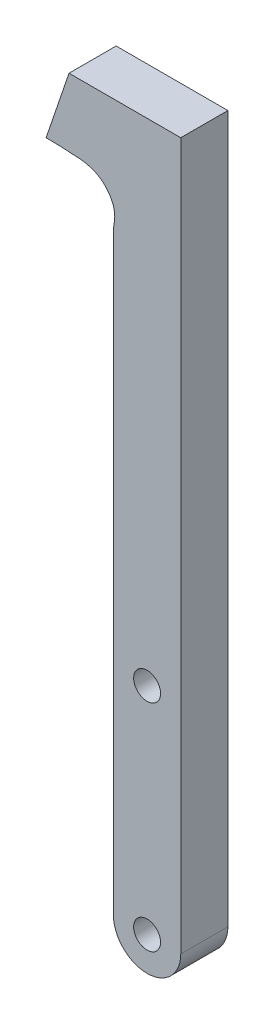
ISO-10303-21;
HEADER;
FILE_DESCRIPTION(('STEP AP214'),'2;1');
FILE_NAME('part.step','',(''),(''),'','','');
FILE_SCHEMA(('AUTOMOTIVE_DESIGN { 1 0 10303 214 1 1 1 1 }'));
ENDSEC;
DATA;
#1=APPLICATION_CONTEXT('core data for automotive mechanical design processes');
#2=APPLICATION_PROTOCOL_DEFINITION('international standard','automotive_design',2000,#1);
#3=PRODUCT_CONTEXT('',#1,'mechanical');
#4=PRODUCT('Part','Part','',(#3));
#5=PRODUCT_RELATED_PRODUCT_CATEGORY('part','',(#4));
#6=PRODUCT_DEFINITION_FORMATION('','',#4);
#7=PRODUCT_DEFINITION_CONTEXT('part definition',#1,'design');
#8=PRODUCT_DEFINITION('design','',#6,#7);
#9=PRODUCT_DEFINITION_SHAPE('','',#8);
#10=(LENGTH_UNIT() NAMED_UNIT(*) SI_UNIT(.MILLI.,.METRE.));
#11=(NAMED_UNIT(*) PLANE_ANGLE_UNIT() SI_UNIT($,.RADIAN.));
#12=(NAMED_UNIT(*) SI_UNIT($,.STERADIAN.) SOLID_ANGLE_UNIT());
#13=UNCERTAINTY_MEASURE_WITH_UNIT(LENGTH_MEASURE(1.E-05),#10,'distance_accuracy_value','');
#14=(GEOMETRIC_REPRESENTATION_CONTEXT(3) GLOBAL_UNCERTAINTY_ASSIGNED_CONTEXT((#13)) GLOBAL_UNIT_ASSIGNED_CONTEXT((#10,
#11,#12)) REPRESENTATION_CONTEXT('',''));
#15=CARTESIAN_POINT('',(0.,0.,0.));
#16=DIRECTION('',(0.,0.,1.));
#17=DIRECTION('',(1.,0.,0.));
#18=AXIS2_PLACEMENT_3D('',#15,#16,#17);
#19=CARTESIAN_POINT('',(0.,-5.,-0.175));
#20=CARTESIAN_POINT('',(0.,-5.,1.10833333333334));
#21=CARTESIAN_POINT('',(0.,-5.,2.39166666666666));
#22=CARTESIAN_POINT('',(0.,-5.,3.675));
#23=CARTESIAN_POINT('',(5.,-5.,-0.175));
#24=CARTESIAN_POINT('',(5.,-5.,1.10833333333333));
#25=CARTESIAN_POINT('',(5.,-5.,2.39166666666667));
#26=CARTESIAN_POINT('',(5.,-5.,3.675));
#27=CARTESIAN_POINT('',(5.,-8.,-0.175));
#28=CARTESIAN_POINT('',(5.,-8.,1.10833333333334));
#29=CARTESIAN_POINT('',(5.,-8.,2.39166666666666));
#30=CARTESIAN_POINT('',(5.,-8.,3.675));
#31=(BOUNDED_SURFACE() B_SPLINE_SURFACE(2,3,((#19,#20,#21,#22),(#23,#24,#25,#26),(#27,#28,#29,
#30)),.UNSPECIFIED.,.F.,.F.,.F.) B_SPLINE_SURFACE_WITH_KNOTS((3,3),(4,4),(0.,1.),(-0.003675,
0.000175),.UNSPECIFIED.) GEOMETRIC_REPRESENTATION_ITEM() RATIONAL_B_SPLINE_SURFACE(((1.,1.,1.,
1.),(1.5,1.5,1.5,1.5),(1.,1.,1.,1.))) REPRESENTATION_ITEM('') SURFACE());
#32=CARTESIAN_POINT('',(0.,-5.,0.));
#33=CARTESIAN_POINT('',(5.,-5.,0.));
#34=CARTESIAN_POINT('',(5.,-8.,0.));
#35=(BOUNDED_CURVE() B_SPLINE_CURVE(2,(#32,#33,#34),.UNSPECIFIED.,.F.,
.F.) B_SPLINE_CURVE_WITH_KNOTS((3,3),(0.,1.),
.UNSPECIFIED.) CURVE() GEOMETRIC_REPRESENTATION_ITEM() RATIONAL_B_SPLINE_CURVE((1.,1.5,1.)) REPRESENTATION_ITEM(''));
#36=CARTESIAN_POINT('',(1.946256565614,-5.07275748974495,0.));
#37=VERTEX_POINT('',#36);
#38=CARTESIAN_POINT('',(0.,-5.,0.));
#39=VERTEX_POINT('',#38);
#40=EDGE_CURVE('E346',#37,#39,#35,.F.);
#41=DIRECTION('',(0.,0.,1.));
#42=VECTOR('',#41,1.);
#43=CARTESIAN_POINT('',(1.9462603777861,-5.07271665063485,0.));
#44=LINE('',#43,#42);
#45=CARTESIAN_POINT('',(1.94625661845235,-5.07275692691918,3.5));
#46=VERTEX_POINT('',#45);
#47=EDGE_CURVE('E353',#37,#46,#44,.T.);
#48=CARTESIAN_POINT('',(5.,-8.,3.5));
#49=CARTESIAN_POINT('',(5.,-5.,3.5));
#50=CARTESIAN_POINT('',(0.,-5.,3.5));
#51=(BOUNDED_CURVE() B_SPLINE_CURVE(2,(#48,#49,#50),.UNSPECIFIED.,.F.,
.F.) B_SPLINE_CURVE_WITH_KNOTS((3,3),(0.,1.),
.UNSPECIFIED.) CURVE() GEOMETRIC_REPRESENTATION_ITEM() RATIONAL_B_SPLINE_CURVE((1.,1.5,1.)) REPRESENTATION_ITEM(''));
#52=CARTESIAN_POINT('',(0.,-5.,3.5));
#53=VERTEX_POINT('',#52);
#54=EDGE_CURVE('E157',#53,#46,#51,.F.);
#55=CARTESIAN_POINT('',(0.,-5.,3.675));
#56=CARTESIAN_POINT('',(0.,-5.,2.39166666666666));
#57=CARTESIAN_POINT('',(0.,-5.,1.10833333333334));
#58=CARTESIAN_POINT('',(0.,-5.,-0.175));
#59=(BOUNDED_CURVE() B_SPLINE_CURVE(3,(#55,#56,#57,#58),.UNSPECIFIED.,.F.,
.F.) B_SPLINE_CURVE_WITH_KNOTS((4,4),(-0.003675,0.000175),
.UNSPECIFIED.) CURVE() GEOMETRIC_REPRESENTATION_ITEM() RATIONAL_B_SPLINE_CURVE((1.,1.,1.,1.)) REPRESENTATION_ITEM(''));
#60=EDGE_CURVE('E229',#53,#39,#59,.T.);
#61=ORIENTED_EDGE('',*,*,#40,.F.);
#62=ORIENTED_EDGE('',*,*,#47,.T.);
#63=ORIENTED_EDGE('',*,*,#54,.F.);
#64=ORIENTED_EDGE('',*,*,#60,.T.);
#65=EDGE_LOOP('',(#61,#62,#63,#64));
#66=FACE_BOUND('',#65,.T.);
#67=ADVANCED_FACE('F41',(#66),#31,.T.);
#68=CARTESIAN_POINT('',(5.,-5.,3.5));
#69=DIRECTION('',(1.,0.,0.));
#70=DIRECTION('',(0.,1.,0.));
#71=AXIS2_PLACEMENT_3D('',#68,#69,#70);
#72=PLANE('',#71);
#73=DIRECTION('',(0.,-1.,0.));
#74=VECTOR('',#73,1.);
#75=CARTESIAN_POINT('',(5.,-5.,3.5));
#76=LINE('',#75,#74);
#77=CARTESIAN_POINT('',(5.,-8.51042892134484,3.5));
#78=VERTEX_POINT('',#77);
#79=CARTESIAN_POINT('',(5.00000000000001,-52.5,3.5));
#80=VERTEX_POINT('',#79);
#81=EDGE_CURVE('E306',#78,#80,#76,.T.);
#82=ORIENTED_EDGE('',*,*,#81,.F.);
#83=DIRECTION('',(0.,0.,-1.));
#84=VECTOR('',#83,1.);
#85=CARTESIAN_POINT('',(5.,-8.51042892134484,3.5));
#86=LINE('',#85,#84);
#87=CARTESIAN_POINT('',(5.,-8.51042892134484,0.));
#88=VERTEX_POINT('',#87);
#89=EDGE_CURVE('E314',#78,#88,#86,.T.);
#90=ORIENTED_EDGE('',*,*,#89,.T.);
#91=DIRECTION('',(0.,-1.,0.));
#92=VECTOR('',#91,1.);
#93=CARTESIAN_POINT('',(5.,-5.,0.));
#94=LINE('',#93,#92);
#95=CARTESIAN_POINT('',(5.00000000000001,-52.5,0.));
#96=VERTEX_POINT('',#95);
#97=EDGE_CURVE('E300',#88,#96,#94,.T.);
#98=ORIENTED_EDGE('',*,*,#97,.T.);
#99=DIRECTION('',(0.,0.,-1.));
#100=VECTOR('',#99,1.);
#101=CARTESIAN_POINT('',(5.00000000000001,-52.5,3.5));
#102=LINE('',#101,#100);
#103=EDGE_CURVE('E330',#80,#96,#102,.T.);
#104=ORIENTED_EDGE('',*,*,#103,.F.);
#105=EDGE_LOOP('',(#82,#90,#98,#104));
#106=FACE_BOUND('',#105,.T.);
#107=ADVANCED_FACE('F190',(#106),#72,.F.);
#108=CARTESIAN_POINT('',(7.50000000000001,-52.5,3.5));
#109=DIRECTION('',(0.,0.,-1.));
#110=DIRECTION('',(-1.,0.,0.));
#111=AXIS2_PLACEMENT_3D('',#108,#109,#110);
#112=CYLINDRICAL_SURFACE('',#111,2.5);
#113=CARTESIAN_POINT('',(7.50000000000001,-52.5,0.));
#114=DIRECTION('',(0.,0.,1.));
#115=DIRECTION('',(1.,0.,0.));
#116=AXIS2_PLACEMENT_3D('',#113,#114,#115);
#117=CIRCLE('',#116,2.5);
#118=CARTESIAN_POINT('',(10.,-52.5,0.));
#119=VERTEX_POINT('',#118);
#120=EDGE_CURVE('E313',#96,#119,#117,.T.);
#121=ORIENTED_EDGE('',*,*,#120,.T.);
#122=DIRECTION('',(0.,0.,-1.));
#123=VECTOR('',#122,1.);
#124=CARTESIAN_POINT('',(10.,-52.5,3.5));
#125=LINE('',#124,#123);
#126=CARTESIAN_POINT('',(10.,-52.5,3.5));
#127=VERTEX_POINT('',#126);
#128=EDGE_CURVE('E327',#127,#119,#125,.T.);
#129=ORIENTED_EDGE('',*,*,#128,.F.);
#130=CARTESIAN_POINT('',(7.50000000000001,-52.5,3.5));
#131=DIRECTION('',(0.,0.,1.));
#132=DIRECTION('',(1.,0.,0.));
#133=AXIS2_PLACEMENT_3D('',#130,#131,#132);
#134=CIRCLE('',#133,2.5);
#135=EDGE_CURVE('E303',#80,#127,#134,.T.);
#136=ORIENTED_EDGE('',*,*,#135,.F.);
#137=ORIENTED_EDGE('',*,*,#103,.T.);
#138=EDGE_LOOP('',(#121,#129,#136,#137));
#139=FACE_BOUND('',#138,.T.);
#140=ADVANCED_FACE('F410',(#139),#112,.T.);
#141=CARTESIAN_POINT('',(10.,0.,3.5));
#142=DIRECTION('',(-1.,0.,0.));
#143=DIRECTION('',(0.,-1.,0.));
#144=AXIS2_PLACEMENT_3D('',#141,#142,#143);
#145=PLANE('',#144);
#146=DIRECTION('',(0.,1.,0.));
#147=VECTOR('',#146,1.);
#148=CARTESIAN_POINT('',(10.,0.,0.));
#149=LINE('',#148,#147);
#150=CARTESIAN_POINT('',(10.,0.,0.));
#151=VERTEX_POINT('',#150);
#152=EDGE_CURVE('E320',#119,#151,#149,.T.);
#153=ORIENTED_EDGE('',*,*,#152,.T.);
#154=DIRECTION('',(0.,0.,-1.));
#155=VECTOR('',#154,1.);
#156=CARTESIAN_POINT('',(10.,0.,3.5));
#157=LINE('',#156,#155);
#158=CARTESIAN_POINT('',(10.,0.,3.5));
#159=VERTEX_POINT('',#158);
#160=EDGE_CURVE('E324',#159,#151,#157,.T.);
#161=ORIENTED_EDGE('',*,*,#160,.F.);
#162=DIRECTION('',(0.,1.,0.));
#163=VECTOR('',#162,1.);
#164=CARTESIAN_POINT('',(10.,0.,3.5));
#165=LINE('',#164,#163);
#166=EDGE_CURVE('E412',#127,#159,#165,.T.);
#167=ORIENTED_EDGE('',*,*,#166,.F.);
#168=ORIENTED_EDGE('',*,*,#128,.T.);
#169=EDGE_LOOP('',(#153,#161,#167,#168));
#170=FACE_BOUND('',#169,.T.);
#171=ADVANCED_FACE('F420',(#170),#145,.F.);
#172=CARTESIAN_POINT('',(0.,0.,3.5));
#173=DIRECTION('',(0.,-1.,0.));
#174=DIRECTION('',(0.,0.,-1.));
#175=AXIS2_PLACEMENT_3D('',#172,#173,#174);
#176=PLANE('',#175);
#177=DIRECTION('',(-1.,0.,0.));
#178=VECTOR('',#177,1.);
#179=CARTESIAN_POINT('',(0.,0.,0.));
#180=LINE('',#179,#178);
#181=CARTESIAN_POINT('',(1.70093196052755,0.,0.));
#182=VERTEX_POINT('',#181);
#183=EDGE_CURVE('E309',#151,#182,#180,.T.);
#184=ORIENTED_EDGE('',*,*,#183,.T.);
#185=DIRECTION('',(0.,0.,1.));
#186=VECTOR('',#185,1.);
#187=CARTESIAN_POINT('',(1.70093196052755,0.,0.));
#188=LINE('',#187,#186);
#189=CARTESIAN_POINT('',(1.70093196052755,0.,3.5));
#190=VERTEX_POINT('',#189);
#191=EDGE_CURVE('E276',#182,#190,#188,.T.);
#192=ORIENTED_EDGE('',*,*,#191,.T.);
#193=DIRECTION('',(-1.,0.,0.));
#194=VECTOR('',#193,1.);
#195=CARTESIAN_POINT('',(0.,0.,3.5));
#196=LINE('',#195,#194);
#197=EDGE_CURVE('E318',#159,#190,#196,.T.);
#198=ORIENTED_EDGE('',*,*,#197,.F.);
#199=ORIENTED_EDGE('',*,*,#160,.T.);
#200=EDGE_LOOP('',(#184,#192,#198,#199));
#201=FACE_BOUND('',#200,.T.);
#202=ADVANCED_FACE('F257',(#201),#176,.F.);
#203=CARTESIAN_POINT('',(7.50000000000001,-52.5,3.5));
#204=DIRECTION('',(0.,0.,1.));
#205=DIRECTION('',(1.,0.,0.));
#206=AXIS2_PLACEMENT_3D('',#203,#204,#205);
#207=PLANE('',#206);
#208=ORIENTED_EDGE('',*,*,#54,.T.);
#209=CARTESIAN_POINT('',(2.12823183675205,-3.08101225787928,3.5));
#210=DIRECTION('',(0.,0.,1.));
#211=DIRECTION('',(1.,0.,0.));
#212=AXIS2_PLACEMENT_3D('',#209,#210,#211);
#213=CIRCLE('',#212,2.);
#214=CARTESIAN_POINT('',(2.11169040347796,-5.08094385195575,3.5));
#215=VERTEX_POINT('',#214);
#216=EDGE_CURVE('E64',#46,#215,#213,.T.);
#217=ORIENTED_EDGE('',*,*,#216,.T.);
#218=CARTESIAN_POINT('',(5.14337315153579,-7.30566222958373,3.5));
#219=CARTESIAN_POINT('',(4.54370812674458,-5.06484262726541,3.5));
#220=CARTESIAN_POINT('',(2.03078372862046,-5.0808709653224,3.5));
#221=B_SPLINE_CURVE_WITH_KNOTS('',2,(#218,#219,#220),.UNSPECIFIED.,.F.,.F.,(3,3),(0.,1.),.UNSPECIFIED.);
#222=CARTESIAN_POINT('',(4.31044133772846,-5.82922326342393,3.5));
#223=VERTEX_POINT('',#222);
#224=EDGE_CURVE('E137',#223,#215,#221,.T.);
#225=ORIENTED_EDGE('',*,*,#224,.F.);
#226=CARTESIAN_POINT('',(5.,-8.,3.5));
#227=CARTESIAN_POINT('',(5.,-5.,3.5));
#228=CARTESIAN_POINT('',(0.,-5.,3.5));
#229=(BOUNDED_CURVE() B_SPLINE_CURVE(2,(#226,#227,#228),.UNSPECIFIED.,.F.,
.F.) B_SPLINE_CURVE_WITH_KNOTS((3,3),(0.,1.),
.UNSPECIFIED.) CURVE() GEOMETRIC_REPRESENTATION_ITEM() RATIONAL_B_SPLINE_CURVE((1.,1.5,1.)) REPRESENTATION_ITEM(''));
#230=CARTESIAN_POINT('',(4.40538719862827,-5.92245863426485,3.5));
#231=VERTEX_POINT('',#230);
#232=EDGE_CURVE('E149',#223,#231,#229,.F.);
#233=ORIENTED_EDGE('',*,*,#232,.T.);
#234=CARTESIAN_POINT('',(4.8959040399802,-6.63276714125316,3.5));
#235=VERTEX_POINT('',#234);
#236=EDGE_CURVE('E152',#235,#231,#221,.T.);
#237=ORIENTED_EDGE('',*,*,#236,.F.);
#238=CARTESIAN_POINT('',(3.09828473546055,-7.50944543801788,3.5));
#239=DIRECTION('',(0.,0.,1.));
#240=DIRECTION('',(1.,0.,0.));
#241=AXIS2_PLACEMENT_3D('',#238,#239,#240);
#242=CIRCLE('',#241,2.);
#243=CARTESIAN_POINT('',(5.08061958336105,-7.77467845029066,3.5));
#244=VERTEX_POINT('',#243);
#245=EDGE_CURVE('E360',#235,#244,#242,.F.);
#246=ORIENTED_EDGE('',*,*,#245,.T.);
#247=DIRECTION('',(0.132616506136389,0.991167423950251,0.));
#248=VECTOR('',#247,1.);
#249=CARTESIAN_POINT('',(5.14337315153579,-7.30566222958373,3.5));
#250=LINE('',#249,#248);
#251=CARTESIAN_POINT('',(5.0176651520995,-8.24519590907206,3.5));
#252=VERTEX_POINT('',#251);
#253=EDGE_CURVE('E282',#252,#244,#250,.T.);
#254=ORIENTED_EDGE('',*,*,#253,.F.);
#255=CARTESIAN_POINT('',(7.,-8.51042892134484,3.5));
#256=DIRECTION('',(0.,0.,1.));
#257=DIRECTION('',(1.,0.,0.));
#258=AXIS2_PLACEMENT_3D('',#255,#256,#257);
#259=CIRCLE('',#258,2.);
#260=EDGE_CURVE('E368',#252,#78,#259,.T.);
#261=ORIENTED_EDGE('',*,*,#260,.T.);
#262=ORIENTED_EDGE('',*,*,#81,.T.);
#263=ORIENTED_EDGE('',*,*,#135,.T.);
#264=ORIENTED_EDGE('',*,*,#166,.T.);
#265=ORIENTED_EDGE('',*,*,#197,.T.);
#266=DIRECTION('',(0.322060904560842,0.946718951829661,0.));
#267=VECTOR('',#266,1.);
#268=CARTESIAN_POINT('',(1.70093196052755,0.,3.5));
#269=LINE('',#268,#267);
#270=EDGE_CURVE('E265',#53,#190,#269,.T.);
#271=ORIENTED_EDGE('',*,*,#270,.F.);
#272=EDGE_LOOP('',(#208,#217,#225,#233,#237,#246,#254,#261,#262,#263,#264,#265,#271));
#273=FACE_BOUND('',#272,.T.);
#274=CARTESIAN_POINT('',(7.50000000000001,-36.5,3.5));
#275=DIRECTION('',(0.,0.,1.));
#276=DIRECTION('',(1.,0.,0.));
#277=AXIS2_PLACEMENT_3D('',#274,#275,#276);
#278=CIRCLE('',#277,1.);
#279=CARTESIAN_POINT('',(8.50000000000001,-36.5,3.5));
#280=VERTEX_POINT('',#279);
#281=EDGE_CURVE('E290',#280,#280,#278,.T.);
#282=ORIENTED_EDGE('',*,*,#281,.F.);
#283=EDGE_LOOP('',(#282));
#284=FACE_BOUND('',#283,.T.);
#285=CARTESIAN_POINT('',(7.50000000000001,-52.5,3.5));
#286=DIRECTION('',(0.,0.,1.));
#287=DIRECTION('',(1.,0.,0.));
#288=AXIS2_PLACEMENT_3D('',#285,#286,#287);
#289=CIRCLE('',#288,1.);
#290=CARTESIAN_POINT('',(8.50000000000001,-52.5,3.5));
#291=VERTEX_POINT('',#290);
#292=EDGE_CURVE('E297',#291,#291,#289,.T.);
#293=ORIENTED_EDGE('',*,*,#292,.F.);
#294=EDGE_LOOP('',(#293));
#295=FACE_BOUND('',#294,.T.);
#296=ADVANCED_FACE('F146',(#273,#284,#295),#207,.T.);
#297=CARTESIAN_POINT('',(7.50000000000001,-52.5,0.));
#298=DIRECTION('',(0.,0.,1.));
#299=DIRECTION('',(1.,0.,0.));
#300=AXIS2_PLACEMENT_3D('',#297,#298,#299);
#301=PLANE('',#300);
#302=CARTESIAN_POINT('',(7.50000000000001,-36.5,0.));
#303=DIRECTION('',(0.,0.,1.));
#304=DIRECTION('',(1.,0.,0.));
#305=AXIS2_PLACEMENT_3D('',#302,#303,#304);
#306=CIRCLE('',#305,1.);
#307=CARTESIAN_POINT('',(8.50000000000001,-36.5,0.));
#308=VERTEX_POINT('',#307);
#309=EDGE_CURVE('E293',#308,#308,#306,.T.);
#310=ORIENTED_EDGE('',*,*,#309,.T.);
#311=EDGE_LOOP('',(#310));
#312=FACE_BOUND('',#311,.T.);
#313=CARTESIAN_POINT('',(7.50000000000001,-52.5,0.));
#314=DIRECTION('',(0.,0.,-1.));
#315=DIRECTION('',(-1.,0.,0.));
#316=AXIS2_PLACEMENT_3D('',#313,#314,#315);
#317=CIRCLE('',#316,1.);
#318=CARTESIAN_POINT('',(6.50000000000001,-52.5,0.));
#319=VERTEX_POINT('',#318);
#320=EDGE_CURVE('E294',#319,#319,#317,.T.);
#321=ORIENTED_EDGE('',*,*,#320,.F.);
#322=EDGE_LOOP('',(#321));
#323=FACE_BOUND('',#322,.T.);
#324=CARTESIAN_POINT('',(5.14337315153579,-7.30566222958373,0.));
#325=CARTESIAN_POINT('',(4.54370812674458,-5.06484262726541,0.));
#326=CARTESIAN_POINT('',(2.03078372862046,-5.0808709653224,0.));
#327=B_SPLINE_CURVE_WITH_KNOTS('',2,(#324,#325,#326),.UNSPECIFIED.,.F.,.F.,(3,3),(0.,1.),.UNSPECIFIED.);
#328=CARTESIAN_POINT('',(4.31043898647067,-5.82922581822609,0.));
#329=VERTEX_POINT('',#328);
#330=CARTESIAN_POINT('',(2.11169040347796,-5.08094385195575,0.));
#331=VERTEX_POINT('',#330);
#332=EDGE_CURVE('E138',#329,#331,#327,.T.);
#333=ORIENTED_EDGE('',*,*,#332,.T.);
#334=CARTESIAN_POINT('',(2.12823183675205,-3.08101225787928,0.));
#335=DIRECTION('',(0.,0.,1.));
#336=DIRECTION('',(1.,0.,0.));
#337=AXIS2_PLACEMENT_3D('',#334,#335,#336);
#338=CIRCLE('',#337,2.);
#339=EDGE_CURVE('E12',#331,#37,#338,.F.);
#340=ORIENTED_EDGE('',*,*,#339,.T.);
#341=ORIENTED_EDGE('',*,*,#40,.T.);
#342=DIRECTION('',(0.322060904560842,0.946718951829661,0.));
#343=VECTOR('',#342,1.);
#344=CARTESIAN_POINT('',(1.70093196052755,0.,0.));
#345=LINE('',#344,#343);
#346=EDGE_CURVE('E272',#39,#182,#345,.T.);
#347=ORIENTED_EDGE('',*,*,#346,.T.);
#348=ORIENTED_EDGE('',*,*,#183,.F.);
#349=ORIENTED_EDGE('',*,*,#152,.F.);
#350=ORIENTED_EDGE('',*,*,#120,.F.);
#351=ORIENTED_EDGE('',*,*,#97,.F.);
#352=CARTESIAN_POINT('',(7.,-8.51042892134484,0.));
#353=DIRECTION('',(0.,0.,1.));
#354=DIRECTION('',(1.,0.,0.));
#355=AXIS2_PLACEMENT_3D('',#352,#353,#354);
#356=CIRCLE('',#355,2.);
#357=CARTESIAN_POINT('',(5.0176651520995,-8.24519590907206,0.));
#358=VERTEX_POINT('',#357);
#359=EDGE_CURVE('E397',#88,#358,#356,.F.);
#360=ORIENTED_EDGE('',*,*,#359,.T.);
#361=DIRECTION('',(0.132616506136389,0.991167423950251,0.));
#362=VECTOR('',#361,1.);
#363=CARTESIAN_POINT('',(-0.755757521269309,-51.3953937634305,0.));
#364=LINE('',#363,#362);
#365=CARTESIAN_POINT('',(5.08061958336105,-7.77467845029065,0.));
#366=VERTEX_POINT('',#365);
#367=EDGE_CURVE('E142',#358,#366,#364,.T.);
#368=ORIENTED_EDGE('',*,*,#367,.T.);
#369=CARTESIAN_POINT('',(3.09828473546055,-7.50944543801788,0.));
#370=DIRECTION('',(0.,0.,1.));
#371=DIRECTION('',(1.,0.,0.));
#372=AXIS2_PLACEMENT_3D('',#369,#370,#371);
#373=CIRCLE('',#372,2.);
#374=CARTESIAN_POINT('',(4.8959040399802,-6.63276714125316,0.));
#375=VERTEX_POINT('',#374);
#376=EDGE_CURVE('E347',#366,#375,#373,.T.);
#377=ORIENTED_EDGE('',*,*,#376,.T.);
#378=CARTESIAN_POINT('',(4.40538547505516,-5.92246027519678,0.));
#379=VERTEX_POINT('',#378);
#380=EDGE_CURVE('E278',#375,#379,#327,.T.);
#381=ORIENTED_EDGE('',*,*,#380,.T.);
#382=CARTESIAN_POINT('',(0.,-5.,0.));
#383=CARTESIAN_POINT('',(5.,-5.,0.));
#384=CARTESIAN_POINT('',(5.,-8.,0.));
#385=(BOUNDED_CURVE() B_SPLINE_CURVE(2,(#382,#383,#384),.UNSPECIFIED.,.F.,
.F.) B_SPLINE_CURVE_WITH_KNOTS((3,3),(0.,1.),
.UNSPECIFIED.) CURVE() GEOMETRIC_REPRESENTATION_ITEM() RATIONAL_B_SPLINE_CURVE((1.,1.5,1.)) REPRESENTATION_ITEM(''));
#386=EDGE_CURVE('E158',#379,#329,#385,.F.);
#387=ORIENTED_EDGE('',*,*,#386,.T.);
#388=EDGE_LOOP('',(#333,#340,#341,#347,#348,#349,#350,#351,#360,#368,#377,#381,#387));
#389=FACE_BOUND('',#388,.T.);
#390=ADVANCED_FACE('F252',(#312,#323,#389),#301,.F.);
#391=CARTESIAN_POINT('',(7.50000000000001,-52.5,4.));
#392=DIRECTION('',(0.,0.,-1.));
#393=DIRECTION('',(-1.,0.,0.));
#394=AXIS2_PLACEMENT_3D('',#391,#392,#393);
#395=CYLINDRICAL_SURFACE('',#394,1.);
#396=ORIENTED_EDGE('',*,*,#292,.T.);
#397=EDGE_LOOP('',(#396));
#398=FACE_BOUND('',#397,.T.);
#399=ORIENTED_EDGE('',*,*,#320,.T.);
#400=EDGE_LOOP('',(#399));
#401=FACE_BOUND('',#400,.T.);
#402=ADVANCED_FACE('F248',(#398,#401),#395,.F.);
#403=CARTESIAN_POINT('',(7.50000000000001,-36.5,-6.5));
#404=DIRECTION('',(0.,0.,1.));
#405=DIRECTION('',(1.,0.,0.));
#406=AXIS2_PLACEMENT_3D('',#403,#404,#405);
#407=CYLINDRICAL_SURFACE('',#406,1.);
#408=ORIENTED_EDGE('',*,*,#281,.T.);
#409=EDGE_LOOP('',(#408));
#410=FACE_BOUND('',#409,.T.);
#411=ORIENTED_EDGE('',*,*,#309,.F.);
#412=EDGE_LOOP('',(#411));
#413=FACE_BOUND('',#412,.T.);
#414=ADVANCED_FACE('F243',(#410,#413),#407,.F.);
#415=CARTESIAN_POINT('',(1.70093196052755,0.,0.));
#416=DIRECTION('',(0.946718951829661,-0.322060904560842,0.));
#417=DIRECTION('',(0.322060904560842,0.946718951829661,0.));
#418=AXIS2_PLACEMENT_3D('',#415,#416,#417);
#419=PLANE('',#418);
#420=ORIENTED_EDGE('',*,*,#270,.T.);
#421=ORIENTED_EDGE('',*,*,#191,.F.);
#422=ORIENTED_EDGE('',*,*,#346,.F.);
#423=ORIENTED_EDGE('',*,*,#60,.F.);
#424=EDGE_LOOP('',(#420,#421,#422,#423));
#425=FACE_BOUND('',#424,.T.);
#426=ADVANCED_FACE('F189',(#425),#419,.F.);
#427=DIRECTION('',(0.,0.,1.));
#428=VECTOR('',#427,1.);
#429=CARTESIAN_POINT('',(4.31047692587789,-5.82918453625511,1.75));
#430=LINE('',#429,#428);
#431=EDGE_CURVE('E135',#223,#329,#430,.F.);
#432=DIRECTION('',(0.,0.,1.));
#433=VECTOR('',#432,1.);
#434=CARTESIAN_POINT('',(4.40545252327872,-5.92239722922001,1.75));
#435=LINE('',#434,#433);
#436=EDGE_CURVE('E143',#379,#231,#435,.T.);
#437=ORIENTED_EDGE('',*,*,#232,.F.);
#438=ORIENTED_EDGE('',*,*,#431,.T.);
#439=ORIENTED_EDGE('',*,*,#386,.F.);
#440=ORIENTED_EDGE('',*,*,#436,.T.);
#441=EDGE_LOOP('',(#437,#438,#439,#440));
#442=FACE_BOUND('',#441,.T.);
#443=ADVANCED_FACE('F155',(#442),#31,.T.);
#444=CARTESIAN_POINT('',(5.14337315153579,-7.30566222958373,-2.5));
#445=CARTESIAN_POINT('',(4.54370812674458,-5.06484262726541,-2.5));
#446=CARTESIAN_POINT('',(2.03078372862046,-5.0808709653224,-2.5));
#447=B_SPLINE_CURVE_WITH_KNOTS('',2,(#444,#445,#446),.UNSPECIFIED.,.F.,.F.,(3,3),(0.,1.),.UNSPECIFIED.);
#448=DIRECTION('',(0.,0.,1.));
#449=VECTOR('',#448,1.);
#450=SURFACE_OF_LINEAR_EXTRUSION('',#447,#449);
#451=ORIENTED_EDGE('',*,*,#380,.F.);
#452=DIRECTION('',(0.,0.,1.));
#453=VECTOR('',#452,1.);
#454=CARTESIAN_POINT('',(4.8959040399802,-6.63276714125316,0.));
#455=LINE('',#454,#453);
#456=EDGE_CURVE('E364',#375,#235,#455,.T.);
#457=ORIENTED_EDGE('',*,*,#456,.T.);
#458=ORIENTED_EDGE('',*,*,#236,.T.);
#459=ORIENTED_EDGE('',*,*,#436,.F.);
#460=EDGE_LOOP('',(#451,#457,#458,#459));
#461=FACE_BOUND('',#460,.T.);
#462=ADVANCED_FACE('F188',(#461),#450,.F.);
#463=CARTESIAN_POINT('',(5.14337315153579,-7.30566222958373,-2.5));
#464=DIRECTION('',(0.991167423950251,-0.132616506136389,0.));
#465=DIRECTION('',(0.132616506136389,0.991167423950251,0.));
#466=AXIS2_PLACEMENT_3D('',#463,#464,#465);
#467=PLANE('',#466);
#468=ORIENTED_EDGE('',*,*,#367,.F.);
#469=DIRECTION('',(0.,0.,-1.));
#470=VECTOR('',#469,1.);
#471=CARTESIAN_POINT('',(5.0176651520995,-8.24519590907206,-2.5));
#472=LINE('',#471,#470);
#473=EDGE_CURVE('E372',#358,#252,#472,.F.);
#474=ORIENTED_EDGE('',*,*,#473,.T.);
#475=ORIENTED_EDGE('',*,*,#253,.T.);
#476=DIRECTION('',(0.,0.,-1.));
#477=VECTOR('',#476,1.);
#478=CARTESIAN_POINT('',(5.08061958336105,-7.77467845029066,0.));
#479=LINE('',#478,#477);
#480=EDGE_CURVE('E391',#244,#366,#479,.T.);
#481=ORIENTED_EDGE('',*,*,#480,.T.);
#482=EDGE_LOOP('',(#468,#474,#475,#481));
#483=FACE_BOUND('',#482,.T.);
#484=ADVANCED_FACE('F390',(#483),#467,.F.);
#485=ORIENTED_EDGE('',*,*,#224,.T.);
#486=DIRECTION('',(0.,0.,1.));
#487=VECTOR('',#486,1.);
#488=CARTESIAN_POINT('',(2.11169040347802,-5.08094385195575,3.5));
#489=LINE('',#488,#487);
#490=EDGE_CURVE('E50',#215,#331,#489,.F.);
#491=ORIENTED_EDGE('',*,*,#490,.T.);
#492=ORIENTED_EDGE('',*,*,#332,.F.);
#493=ORIENTED_EDGE('',*,*,#431,.F.);
#494=EDGE_LOOP('',(#485,#491,#492,#493));
#495=FACE_BOUND('',#494,.T.);
#496=ADVANCED_FACE('F136',(#495),#450,.F.);
#497=CARTESIAN_POINT('',(7.,-8.51042892134484,3.5));
#498=DIRECTION('',(0.,0.,-1.));
#499=DIRECTION('',(-1.,0.,0.));
#500=AXIS2_PLACEMENT_3D('',#497,#498,#499);
#501=CYLINDRICAL_SURFACE('',#500,2.);
#502=ORIENTED_EDGE('',*,*,#260,.F.);
#503=ORIENTED_EDGE('',*,*,#473,.F.);
#504=ORIENTED_EDGE('',*,*,#359,.F.);
#505=ORIENTED_EDGE('',*,*,#89,.F.);
#506=EDGE_LOOP('',(#502,#503,#504,#505));
#507=FACE_BOUND('',#506,.T.);
#508=ADVANCED_FACE('F192',(#507),#501,.T.);
#509=CARTESIAN_POINT('',(3.09828473546055,-7.50944543801788,1.75));
#510=DIRECTION('',(0.,0.,1.));
#511=DIRECTION('',(1.,0.,0.));
#512=AXIS2_PLACEMENT_3D('',#509,#510,#511);
#513=CYLINDRICAL_SURFACE('',#512,2.);
#514=ORIENTED_EDGE('',*,*,#376,.F.);
#515=ORIENTED_EDGE('',*,*,#480,.F.);
#516=ORIENTED_EDGE('',*,*,#245,.F.);
#517=ORIENTED_EDGE('',*,*,#456,.F.);
#518=EDGE_LOOP('',(#514,#515,#516,#517));
#519=FACE_BOUND('',#518,.T.);
#520=ADVANCED_FACE('F395',(#519),#513,.F.);
#521=CARTESIAN_POINT('',(2.12823183675205,-3.08101225787928,1.75));
#522=DIRECTION('',(0.,0.,1.));
#523=DIRECTION('',(1.,0.,0.));
#524=AXIS2_PLACEMENT_3D('',#521,#522,#523);
#525=CYLINDRICAL_SURFACE('',#524,2.);
#526=ORIENTED_EDGE('',*,*,#339,.F.);
#527=ORIENTED_EDGE('',*,*,#490,.F.);
#528=ORIENTED_EDGE('',*,*,#216,.F.);
#529=ORIENTED_EDGE('',*,*,#47,.F.);
#530=EDGE_LOOP('',(#526,#527,#528,#529));
#531=FACE_BOUND('',#530,.T.);
#532=ADVANCED_FACE('F43',(#531),#525,.T.);
#533=CLOSED_SHELL('',(#67,#107,#140,#171,#202,#296,#390,#402,#414,#426,#443,#462,#484,#496,#508,
#520,#532));
#534=MANIFOLD_SOLID_BREP('B2',#533);
#535=ADVANCED_BREP_SHAPE_REPRESENTATION('',(#18,#534),#14);
#536=SHAPE_DEFINITION_REPRESENTATION(#9,#535);
ENDSEC;
END-ISO-10303-21;
